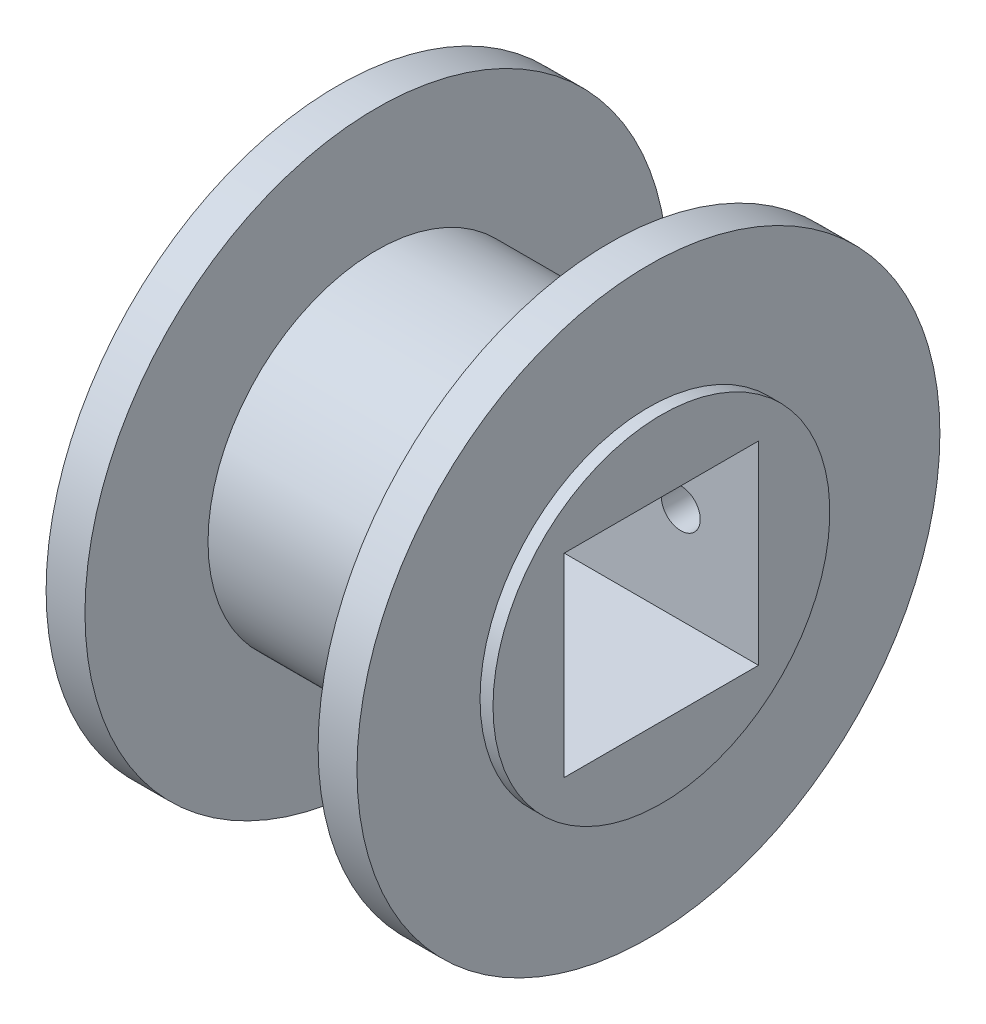
ISO-10303-21;
HEADER;
FILE_DESCRIPTION(('STEP AP214'),'2;1');
FILE_NAME('part.step','',(''),(''),'','','');
FILE_SCHEMA(('AUTOMOTIVE_DESIGN { 1 0 10303 214 1 1 1 1 }'));
ENDSEC;
DATA;
#1=APPLICATION_CONTEXT('core data for automotive mechanical design processes');
#2=APPLICATION_PROTOCOL_DEFINITION('international standard','automotive_design',2000,#1);
#3=PRODUCT_CONTEXT('',#1,'mechanical');
#4=PRODUCT('Part','Part','',(#3));
#5=PRODUCT_RELATED_PRODUCT_CATEGORY('part','',(#4));
#6=PRODUCT_DEFINITION_FORMATION('','',#4);
#7=PRODUCT_DEFINITION_CONTEXT('part definition',#1,'design');
#8=PRODUCT_DEFINITION('design','',#6,#7);
#9=PRODUCT_DEFINITION_SHAPE('','',#8);
#10=(LENGTH_UNIT() NAMED_UNIT(*) SI_UNIT(.MILLI.,.METRE.));
#11=(NAMED_UNIT(*) PLANE_ANGLE_UNIT() SI_UNIT($,.RADIAN.));
#12=(NAMED_UNIT(*) SI_UNIT($,.STERADIAN.) SOLID_ANGLE_UNIT());
#13=UNCERTAINTY_MEASURE_WITH_UNIT(LENGTH_MEASURE(1.E-05),#10,'distance_accuracy_value','');
#14=(GEOMETRIC_REPRESENTATION_CONTEXT(3) GLOBAL_UNCERTAINTY_ASSIGNED_CONTEXT((#13)) GLOBAL_UNIT_ASSIGNED_CONTEXT((#10,
#11,#12)) REPRESENTATION_CONTEXT('',''));
#15=CARTESIAN_POINT('',(0.,0.,0.));
#16=DIRECTION('',(0.,0.,1.));
#17=DIRECTION('',(1.,0.,0.));
#18=AXIS2_PLACEMENT_3D('',#15,#16,#17);
#19=CARTESIAN_POINT('',(-13.,13.,0.));
#20=DIRECTION('',(1.,0.,0.));
#21=DIRECTION('',(0.,0.,-1.));
#22=AXIS2_PLACEMENT_3D('',#19,#20,#21);
#23=PLANE('',#22);
#24=DIRECTION('',(0.,0.,1.));
#25=VECTOR('',#24,1.);
#26=CARTESIAN_POINT('',(-13.,-7.5,7.5));
#27=LINE('',#26,#25);
#28=CARTESIAN_POINT('',(-13.,-7.5,-7.5));
#29=VERTEX_POINT('',#28);
#30=CARTESIAN_POINT('',(-13.,-7.5,7.5));
#31=VERTEX_POINT('',#30);
#32=EDGE_CURVE('E121',#29,#31,#27,.T.);
#33=ORIENTED_EDGE('',*,*,#32,.F.);
#34=DIRECTION('',(0.,-1.,0.));
#35=VECTOR('',#34,1.);
#36=CARTESIAN_POINT('',(-13.,-7.5,-7.5));
#37=LINE('',#36,#35);
#38=CARTESIAN_POINT('',(-13.,7.5,-7.5));
#39=VERTEX_POINT('',#38);
#40=EDGE_CURVE('E54',#39,#29,#37,.T.);
#41=ORIENTED_EDGE('',*,*,#40,.F.);
#42=DIRECTION('',(0.,0.,-1.));
#43=VECTOR('',#42,1.);
#44=CARTESIAN_POINT('',(-13.,7.5,7.5));
#45=LINE('',#44,#43);
#46=CARTESIAN_POINT('',(-13.,7.5,7.5));
#47=VERTEX_POINT('',#46);
#48=EDGE_CURVE('E101',#47,#39,#45,.T.);
#49=ORIENTED_EDGE('',*,*,#48,.F.);
#50=DIRECTION('',(0.,1.,0.));
#51=VECTOR('',#50,1.);
#52=CARTESIAN_POINT('',(-13.,-7.5,7.5));
#53=LINE('',#52,#51);
#54=EDGE_CURVE('E105',#31,#47,#53,.T.);
#55=ORIENTED_EDGE('',*,*,#54,.F.);
#56=EDGE_LOOP('',(#33,#41,#49,#55));
#57=FACE_BOUND('',#56,.T.);
#58=CARTESIAN_POINT('',(-13.,0.,0.));
#59=DIRECTION('',(-1.,0.,0.));
#60=DIRECTION('',(0.,0.,1.));
#61=AXIS2_PLACEMENT_3D('',#58,#59,#60);
#62=CIRCLE('',#61,13.);
#63=CARTESIAN_POINT('',(-13.,0.,13.));
#64=VERTEX_POINT('',#63);
#65=EDGE_CURVE('E130',#64,#64,#62,.T.);
#66=ORIENTED_EDGE('',*,*,#65,.T.);
#67=EDGE_LOOP('',(#66));
#68=FACE_BOUND('',#67,.T.);
#69=ADVANCED_FACE('F38',(#57,#68),#23,.F.);
#70=CARTESIAN_POINT('',(13.,0.,0.));
#71=DIRECTION('',(-1.,0.,0.));
#72=DIRECTION('',(0.,0.,1.));
#73=AXIS2_PLACEMENT_3D('',#70,#71,#72);
#74=PLANE('',#73);
#75=DIRECTION('',(0.,0.,-1.));
#76=VECTOR('',#75,1.);
#77=CARTESIAN_POINT('',(13.,7.5,7.5));
#78=LINE('',#77,#76);
#79=CARTESIAN_POINT('',(13.,7.5,7.5));
#80=VERTEX_POINT('',#79);
#81=CARTESIAN_POINT('',(13.,7.5,-7.5));
#82=VERTEX_POINT('',#81);
#83=EDGE_CURVE('E89',#80,#82,#78,.T.);
#84=ORIENTED_EDGE('',*,*,#83,.T.);
#85=DIRECTION('',(0.,-1.,0.));
#86=VECTOR('',#85,1.);
#87=CARTESIAN_POINT('',(13.,-7.5,-7.5));
#88=LINE('',#87,#86);
#89=CARTESIAN_POINT('',(13.,-7.5,-7.5));
#90=VERTEX_POINT('',#89);
#91=EDGE_CURVE('E82',#82,#90,#88,.T.);
#92=ORIENTED_EDGE('',*,*,#91,.T.);
#93=DIRECTION('',(0.,0.,1.));
#94=VECTOR('',#93,1.);
#95=CARTESIAN_POINT('',(13.,-7.5,7.5));
#96=LINE('',#95,#94);
#97=CARTESIAN_POINT('',(13.,-7.5,7.5));
#98=VERTEX_POINT('',#97);
#99=EDGE_CURVE('E92',#90,#98,#96,.T.);
#100=ORIENTED_EDGE('',*,*,#99,.T.);
#101=DIRECTION('',(0.,1.,0.));
#102=VECTOR('',#101,1.);
#103=CARTESIAN_POINT('',(13.,-7.5,7.5));
#104=LINE('',#103,#102);
#105=EDGE_CURVE('E62',#98,#80,#104,.T.);
#106=ORIENTED_EDGE('',*,*,#105,.T.);
#107=EDGE_LOOP('',(#84,#92,#100,#106));
#108=FACE_BOUND('',#107,.T.);
#109=CARTESIAN_POINT('',(13.,0.,0.));
#110=DIRECTION('',(-1.,0.,0.));
#111=DIRECTION('',(0.,0.,1.));
#112=AXIS2_PLACEMENT_3D('',#109,#110,#111);
#113=CIRCLE('',#112,13.);
#114=CARTESIAN_POINT('',(13.,0.,13.));
#115=VERTEX_POINT('',#114);
#116=EDGE_CURVE('E11',#115,#115,#113,.T.);
#117=ORIENTED_EDGE('',*,*,#116,.F.);
#118=EDGE_LOOP('',(#117));
#119=FACE_BOUND('',#118,.T.);
#120=ADVANCED_FACE('F97',(#108,#119),#74,.F.);
#121=CARTESIAN_POINT('',(-15.7092417804402,0.,0.));
#122=DIRECTION('',(-1.,0.,0.));
#123=DIRECTION('',(0.,0.,1.));
#124=AXIS2_PLACEMENT_3D('',#121,#122,#123);
#125=CYLINDRICAL_SURFACE('',#124,13.);
#126=CARTESIAN_POINT('',(12.,0.,0.));
#127=DIRECTION('',(-1.,0.,0.));
#128=DIRECTION('',(0.,0.,1.));
#129=AXIS2_PLACEMENT_3D('',#126,#127,#128);
#130=CIRCLE('',#129,13.);
#131=CARTESIAN_POINT('',(12.,0.,13.));
#132=VERTEX_POINT('',#131);
#133=EDGE_CURVE('E47',#132,#132,#130,.T.);
#134=ORIENTED_EDGE('',*,*,#133,.F.);
#135=EDGE_LOOP('',(#134));
#136=FACE_BOUND('',#135,.T.);
#137=ORIENTED_EDGE('',*,*,#116,.T.);
#138=EDGE_LOOP('',(#137));
#139=FACE_BOUND('',#138,.T.);
#140=ADVANCED_FACE('F173',(#136,#139),#125,.T.);
#141=CARTESIAN_POINT('',(12.,13.,0.));
#142=DIRECTION('',(-1.,0.,0.));
#143=DIRECTION('',(0.,0.,1.));
#144=AXIS2_PLACEMENT_3D('',#141,#142,#143);
#145=PLANE('',#144);
#146=CARTESIAN_POINT('',(12.,0.,0.));
#147=DIRECTION('',(-1.,0.,0.));
#148=DIRECTION('',(0.,0.,1.));
#149=AXIS2_PLACEMENT_3D('',#146,#147,#148);
#150=CIRCLE('',#149,22.5);
#151=CARTESIAN_POINT('',(12.,0.,22.5));
#152=VERTEX_POINT('',#151);
#153=EDGE_CURVE('E163',#152,#152,#150,.T.);
#154=ORIENTED_EDGE('',*,*,#153,.F.);
#155=EDGE_LOOP('',(#154));
#156=FACE_BOUND('',#155,.T.);
#157=ORIENTED_EDGE('',*,*,#133,.T.);
#158=EDGE_LOOP('',(#157));
#159=FACE_BOUND('',#158,.T.);
#160=ADVANCED_FACE('F171',(#156,#159),#145,.F.);
#161=CARTESIAN_POINT('',(-15.7092417804402,0.,0.));
#162=DIRECTION('',(-1.,0.,0.));
#163=DIRECTION('',(0.,0.,1.));
#164=AXIS2_PLACEMENT_3D('',#161,#162,#163);
#165=CYLINDRICAL_SURFACE('',#164,22.5);
#166=CARTESIAN_POINT('',(8.99999999999999,0.,0.));
#167=DIRECTION('',(-1.,0.,0.));
#168=DIRECTION('',(0.,0.,1.));
#169=AXIS2_PLACEMENT_3D('',#166,#167,#168);
#170=CIRCLE('',#169,22.5);
#171=CARTESIAN_POINT('',(8.99999999999999,0.,22.5));
#172=VERTEX_POINT('',#171);
#173=EDGE_CURVE('E159',#172,#172,#170,.T.);
#174=ORIENTED_EDGE('',*,*,#173,.F.);
#175=EDGE_LOOP('',(#174));
#176=FACE_BOUND('',#175,.T.);
#177=ORIENTED_EDGE('',*,*,#153,.T.);
#178=EDGE_LOOP('',(#177));
#179=FACE_BOUND('',#178,.T.);
#180=ADVANCED_FACE('F186',(#176,#179),#165,.T.);
#181=CARTESIAN_POINT('',(9.,22.5,0.));
#182=DIRECTION('',(1.,0.,0.));
#183=DIRECTION('',(0.,0.,-1.));
#184=AXIS2_PLACEMENT_3D('',#181,#182,#183);
#185=PLANE('',#184);
#186=CARTESIAN_POINT('',(9.,0.,0.));
#187=DIRECTION('',(-1.,0.,0.));
#188=DIRECTION('',(0.,0.,1.));
#189=AXIS2_PLACEMENT_3D('',#186,#187,#188);
#190=CIRCLE('',#189,13.);
#191=CARTESIAN_POINT('',(9.,0.,13.));
#192=VERTEX_POINT('',#191);
#193=EDGE_CURVE('E155',#192,#192,#190,.T.);
#194=ORIENTED_EDGE('',*,*,#193,.F.);
#195=EDGE_LOOP('',(#194));
#196=FACE_BOUND('',#195,.T.);
#197=ORIENTED_EDGE('',*,*,#173,.T.);
#198=EDGE_LOOP('',(#197));
#199=FACE_BOUND('',#198,.T.);
#200=ADVANCED_FACE('F190',(#196,#199),#185,.F.);
#201=CARTESIAN_POINT('',(-15.7092417804402,0.,0.));
#202=DIRECTION('',(-1.,0.,0.));
#203=DIRECTION('',(0.,0.,1.));
#204=AXIS2_PLACEMENT_3D('',#201,#202,#203);
#205=CYLINDRICAL_SURFACE('',#204,13.);
#206=CARTESIAN_POINT('',(8.5,0.,-13.));
#207=CARTESIAN_POINT('',(8.4999964031671,0.0839563147427419,-12.9999989044515));
#208=CARTESIAN_POINT('',(8.4929275849652,0.167966345196187,-12.999178081572));
#209=CARTESIAN_POINT('',(8.46483826496663,0.333652235419371,-12.995982599614));
#210=CARTESIAN_POINT('',(8.44380286531638,0.415325505475652,-12.9936062813601));
#211=CARTESIAN_POINT('',(8.38840533385725,0.573914972249219,-12.9875677351869));
#212=CARTESIAN_POINT('',(8.35405179569065,0.650834199520697,-12.9839063366207));
#213=CARTESIAN_POINT('',(8.27301111812132,0.797799793787138,-12.9757057473599));
#214=CARTESIAN_POINT('',(8.22632623210123,0.867847413269115,-12.9711667170809));
#215=CARTESIAN_POINT('',(8.12171196440118,0.999427807179225,-12.9616943551208));
#216=CARTESIAN_POINT('',(8.06373605262275,1.06092347729182,-12.9567594432832));
#217=CARTESIAN_POINT('',(7.93828516324756,1.17333502414497,-12.9470643855765));
#218=CARTESIAN_POINT('',(7.87080972079665,1.2242503828419,-12.9423042482743));
#219=CARTESIAN_POINT('',(7.72803733610484,1.3141916873334,-12.9334819604022));
#220=CARTESIAN_POINT('',(7.65271863992229,1.3531833171573,-12.9294218388056));
#221=CARTESIAN_POINT('',(7.49654783804119,1.41795120910938,-12.9224797052987));
#222=CARTESIAN_POINT('',(7.41569591201296,1.44372790011126,-12.9195976551562));
#223=CARTESIAN_POINT('',(7.25113647537629,1.48122247723766,-12.9153528047108));
#224=CARTESIAN_POINT('',(7.1674433262594,1.49300261981048,-12.9139832786549));
#225=CARTESIAN_POINT('',(6.99925756045587,1.50236226854616,-12.9128978570991));
#226=CARTESIAN_POINT('',(6.91476497143116,1.49994226427626,-12.9131819045903));
#227=CARTESIAN_POINT('',(6.74781068672891,1.48102150197295,-12.9153653842397));
#228=CARTESIAN_POINT('',(6.66534113040741,1.46458907258954,-12.9172569773873));
#229=CARTESIAN_POINT('',(6.50433810598175,1.41821640637187,-12.9224301836669));
#230=CARTESIAN_POINT('',(6.42580470681433,1.38827593305336,-12.9257118211342));
#231=CARTESIAN_POINT('',(6.27468953076391,1.31566282618376,-12.9333043079058));
#232=CARTESIAN_POINT('',(6.20212227049773,1.27296024500285,-12.9376175732259));
#233=CARTESIAN_POINT('',(6.06515827049276,1.17605655290097,-12.9467853893456));
#234=CARTESIAN_POINT('',(6.00076184949449,1.12185499363063,-12.9516399612475));
#235=CARTESIAN_POINT('',(5.88157071619169,1.0031120359915,-12.9613782949516));
#236=CARTESIAN_POINT('',(5.82683470870206,0.938511694342138,-12.9662620604919));
#237=CARTESIAN_POINT('',(5.72897438783242,0.801008592236029,-12.9754816969276));
#238=CARTESIAN_POINT('',(5.68585009493269,0.728105817136098,-12.9798175668567));
#239=CARTESIAN_POINT('',(5.61243828715519,0.57602390567987,-12.9874550212078));
#240=CARTESIAN_POINT('',(5.58215416157141,0.496843118716624,-12.9907563324875));
#241=CARTESIAN_POINT('',(5.53532747265761,0.334473831095742,-12.9959501177405));
#242=CARTESIAN_POINT('',(5.51878436163704,0.251285490311374,-12.9978426478647));
#243=CARTESIAN_POINT('',(5.49998472362038,0.083770420005017,-12.999998373659));
#244=CARTESIAN_POINT('',(5.49764727106811,-0.000547113543200863,-13.0002707984128));
#245=CARTESIAN_POINT('',(5.50711215461105,-0.168372695685006,-12.9991804669134));
#246=CARTESIAN_POINT('',(5.51891423501223,-0.251880758889223,-12.9978177402298));
#247=CARTESIAN_POINT('',(5.55625597280801,-0.415480266956156,-12.993616027243));
#248=CARTESIAN_POINT('',(5.58175732870877,-0.49558056887289,-12.9907811576039));
#249=CARTESIAN_POINT('',(5.64573409622904,-0.650367161714353,-12.9839527929212));
#250=CARTESIAN_POINT('',(5.68420988816444,-0.725053293857112,-12.9799592639147));
#251=CARTESIAN_POINT('',(5.77324114512289,-0.867254744569761,-12.9712363785455));
#252=CARTESIAN_POINT('',(5.82384929591282,-0.934736878832462,-12.9665038451426));
#253=CARTESIAN_POINT('',(5.93563374481516,-1.06027784673837,-12.9568430886348));
#254=CARTESIAN_POINT('',(5.99681039844914,-1.11833636324618,-12.9519148589511));
#255=CARTESIAN_POINT('',(6.12835038533594,-1.22366664140002,-12.9423899602444));
#256=CARTESIAN_POINT('',(6.1987566435089,-1.27088497439797,-12.9377950067668));
#257=CARTESIAN_POINT('',(6.34654757584497,-1.35282617315314,-12.9294843210235));
#258=CARTESIAN_POINT('',(6.42393212787651,-1.38754925754462,-12.9257685733744));
#259=CARTESIAN_POINT('',(6.58330615373548,-1.44342658284102,-12.9196483466479));
#260=CARTESIAN_POINT('',(6.66528470793036,-1.46461162925532,-12.91724089246));
#261=CARTESIAN_POINT('',(6.83166493951436,-1.49291104062265,-12.9140010380224));
#262=CARTESIAN_POINT('',(6.91606652196453,-1.50002595610949,-12.9131685761468));
#263=CARTESIAN_POINT('',(7.08436565375942,-1.49997405326828,-12.9131745631781));
#264=CARTESIAN_POINT('',(7.168263241811,-1.49289116482699,-12.9140031925958));
#265=CARTESIAN_POINT('',(7.33366750199322,-1.46482172327171,-12.9172169582806));
#266=CARTESIAN_POINT('',(7.41517417276498,-1.44383516225563,-12.9196020954323));
#267=CARTESIAN_POINT('',(7.57347609168934,-1.38857911797312,-12.9256572251488));
#268=CARTESIAN_POINT('',(7.65027254258118,-1.35431304208042,-12.9293268880955));
#269=CARTESIAN_POINT('',(7.79703840038788,-1.27347900341466,-12.9375381901497));
#270=CARTESIAN_POINT('',(7.86700777212214,-1.22691097725304,-12.9420798337501));
#271=CARTESIAN_POINT('',(7.99856295332931,-1.12248173071088,-12.9515555600008));
#272=CARTESIAN_POINT('',(8.06009892117499,-1.06455790771248,-12.9564917239034));
#273=CARTESIAN_POINT('',(8.17261111489077,-0.939190054186288,-12.9661816355574));
#274=CARTESIAN_POINT('',(8.22358483240877,-0.871743768617547,-12.9709353397599));
#275=CARTESIAN_POINT('',(8.31366356407028,-0.72899689319709,-12.9797415177439));
#276=CARTESIAN_POINT('',(8.35272930568544,-0.65367139151142,-12.9837916526637));
#277=CARTESIAN_POINT('',(8.41760310503946,-0.497527270565882,-12.9907101076695));
#278=CARTESIAN_POINT('',(8.44342579213558,-0.416714824913398,-12.993579731148));
#279=CARTESIAN_POINT('',(8.47479285483811,-0.279556305332049,-12.9971099824635));
#280=CARTESIAN_POINT('',(8.48423222713368,-0.224080319679961,-12.9981885527758));
#281=CARTESIAN_POINT('',(8.49683698528068,-0.112410914672187,-12.9996339262189));
#282=CARTESIAN_POINT('',(8.50000240845436,-0.0562174995863219,-13.0000007335839));
#283=CARTESIAN_POINT('',(8.5,0.,-13.));
#284=B_SPLINE_CURVE_WITH_KNOTS('',3,(#206,#207,#208,#209,#210,#211,#212,#213,#214,#215,#216,
#217,#218,#219,#220,#221,#222,#223,#224,#225,#226,#227,#228,#229,#230,#231,#232,#233,#234,#235,
#236,#237,#238,#239,#240,#241,#242,#243,#244,#245,#246,#247,#248,#249,#250,#251,#252,#253,#254,
#255,#256,#257,#258,#259,#260,#261,#262,#263,#264,#265,#266,#267,#268,#269,#270,#271,#272,#273,
#274,#275,#276,#277,#278,#279,#280,#281,#282,#283),.UNSPECIFIED.,.T.,.F.,(4,2,2,2,2,2,2,2,2,2,2,
2,2,2,2,2,2,2,2,2,2,2,2,2,2,2,2,2,2,2,2,2,2,2,2,2,2,2,4),(0.,0.251663624421978,
0.503596125244171,0.755366334321086,1.00709056767771,1.25987498270023,1.51267177188699,
1.76618939688668,2.01969879377989,2.27207631201581,2.52444512928255,2.7755903144011,
3.02673989646913,3.27848351780672,3.53023695652505,3.7834711988091,4.0367058877347,
4.29000737900444,4.54329877367693,4.79514587715501,5.04698842639316,5.29813049175019,
5.54927991940193,5.80154039645153,6.05380936112788,6.30729621090898,6.56077862511547,
6.81368217226277,7.06657582364479,7.31797891068328,7.56938214060553,7.82072090595901,
8.07206096641733,8.3248276967652,8.57765438622355,8.83130609524226,9.08467699305617,
9.25319301127889,9.42170802703663),.UNSPECIFIED.);
#285=CARTESIAN_POINT('',(8.5,0.,-13.));
#286=VERTEX_POINT('',#285);
#287=EDGE_CURVE('E108',#286,#286,#284,.T.);
#288=ORIENTED_EDGE('',*,*,#287,.T.);
#289=EDGE_LOOP('',(#288));
#290=FACE_BOUND('',#289,.T.);
#291=CARTESIAN_POINT('',(-9.,0.,0.));
#292=DIRECTION('',(-1.,0.,0.));
#293=DIRECTION('',(0.,0.,1.));
#294=AXIS2_PLACEMENT_3D('',#291,#292,#293);
#295=CIRCLE('',#294,13.);
#296=CARTESIAN_POINT('',(-9.,0.,13.));
#297=VERTEX_POINT('',#296);
#298=EDGE_CURVE('E151',#297,#297,#295,.T.);
#299=ORIENTED_EDGE('',*,*,#298,.F.);
#300=EDGE_LOOP('',(#299));
#301=FACE_BOUND('',#300,.T.);
#302=ORIENTED_EDGE('',*,*,#193,.T.);
#303=EDGE_LOOP('',(#302));
#304=FACE_BOUND('',#303,.T.);
#305=ADVANCED_FACE('F193',(#290,#301,#304),#205,.T.);
#306=CARTESIAN_POINT('',(-9.,13.,0.));
#307=DIRECTION('',(-1.,0.,0.));
#308=DIRECTION('',(0.,0.,1.));
#309=AXIS2_PLACEMENT_3D('',#306,#307,#308);
#310=PLANE('',#309);
#311=CARTESIAN_POINT('',(-9.,0.,0.));
#312=DIRECTION('',(-1.,0.,0.));
#313=DIRECTION('',(0.,0.,1.));
#314=AXIS2_PLACEMENT_3D('',#311,#312,#313);
#315=CIRCLE('',#314,22.5);
#316=CARTESIAN_POINT('',(-9.,0.,22.5));
#317=VERTEX_POINT('',#316);
#318=EDGE_CURVE('E147',#317,#317,#315,.T.);
#319=ORIENTED_EDGE('',*,*,#318,.F.);
#320=EDGE_LOOP('',(#319));
#321=FACE_BOUND('',#320,.T.);
#322=ORIENTED_EDGE('',*,*,#298,.T.);
#323=EDGE_LOOP('',(#322));
#324=FACE_BOUND('',#323,.T.);
#325=ADVANCED_FACE('F198',(#321,#324),#310,.F.);
#326=CARTESIAN_POINT('',(-15.7092417804402,0.,0.));
#327=DIRECTION('',(-1.,0.,0.));
#328=DIRECTION('',(0.,0.,1.));
#329=AXIS2_PLACEMENT_3D('',#326,#327,#328);
#330=CYLINDRICAL_SURFACE('',#329,22.5);
#331=CARTESIAN_POINT('',(-12.,0.,0.));
#332=DIRECTION('',(-1.,0.,0.));
#333=DIRECTION('',(0.,0.,1.));
#334=AXIS2_PLACEMENT_3D('',#331,#332,#333);
#335=CIRCLE('',#334,22.5);
#336=CARTESIAN_POINT('',(-12.,0.,22.5));
#337=VERTEX_POINT('',#336);
#338=EDGE_CURVE('E143',#337,#337,#335,.T.);
#339=ORIENTED_EDGE('',*,*,#338,.F.);
#340=EDGE_LOOP('',(#339));
#341=FACE_BOUND('',#340,.T.);
#342=ORIENTED_EDGE('',*,*,#318,.T.);
#343=EDGE_LOOP('',(#342));
#344=FACE_BOUND('',#343,.T.);
#345=ADVANCED_FACE('F202',(#341,#344),#330,.T.);
#346=CARTESIAN_POINT('',(-12.,22.5,0.));
#347=DIRECTION('',(1.,0.,0.));
#348=DIRECTION('',(0.,0.,-1.));
#349=AXIS2_PLACEMENT_3D('',#346,#347,#348);
#350=PLANE('',#349);
#351=CARTESIAN_POINT('',(-12.,0.,0.));
#352=DIRECTION('',(-1.,0.,0.));
#353=DIRECTION('',(0.,0.,1.));
#354=AXIS2_PLACEMENT_3D('',#351,#352,#353);
#355=CIRCLE('',#354,13.);
#356=CARTESIAN_POINT('',(-12.,0.,13.));
#357=VERTEX_POINT('',#356);
#358=EDGE_CURVE('E139',#357,#357,#355,.T.);
#359=ORIENTED_EDGE('',*,*,#358,.F.);
#360=EDGE_LOOP('',(#359));
#361=FACE_BOUND('',#360,.T.);
#362=ORIENTED_EDGE('',*,*,#338,.T.);
#363=EDGE_LOOP('',(#362));
#364=FACE_BOUND('',#363,.T.);
#365=ADVANCED_FACE('F206',(#361,#364),#350,.F.);
#366=CARTESIAN_POINT('',(-15.7092417804402,0.,0.));
#367=DIRECTION('',(-1.,0.,0.));
#368=DIRECTION('',(0.,0.,1.));
#369=AXIS2_PLACEMENT_3D('',#366,#367,#368);
#370=CYLINDRICAL_SURFACE('',#369,13.);
#371=ORIENTED_EDGE('',*,*,#65,.F.);
#372=EDGE_LOOP('',(#371));
#373=FACE_BOUND('',#372,.T.);
#374=ORIENTED_EDGE('',*,*,#358,.T.);
#375=EDGE_LOOP('',(#374));
#376=FACE_BOUND('',#375,.T.);
#377=ADVANCED_FACE('F210',(#373,#376),#370,.T.);
#378=CARTESIAN_POINT('',(13.,-7.5,-7.5));
#379=DIRECTION('',(0.,0.,-1.));
#380=DIRECTION('',(-1.,0.,0.));
#381=AXIS2_PLACEMENT_3D('',#378,#379,#380);
#382=PLANE('',#381);
#383=CARTESIAN_POINT('',(7.,0.,-7.5));
#384=DIRECTION('',(0.,0.,-1.));
#385=DIRECTION('',(-1.,0.,0.));
#386=AXIS2_PLACEMENT_3D('',#383,#384,#385);
#387=CIRCLE('',#386,1.5);
#388=CARTESIAN_POINT('',(5.5,0.,-7.5));
#389=VERTEX_POINT('',#388);
#390=EDGE_CURVE('E41',#389,#389,#387,.T.);
#391=ORIENTED_EDGE('',*,*,#390,.T.);
#392=EDGE_LOOP('',(#391));
#393=FACE_BOUND('',#392,.T.);
#394=ORIENTED_EDGE('',*,*,#40,.T.);
#395=DIRECTION('',(-1.,0.,0.));
#396=VECTOR('',#395,1.);
#397=CARTESIAN_POINT('',(13.,-7.5,-7.5));
#398=LINE('',#397,#396);
#399=EDGE_CURVE('E78',#90,#29,#398,.T.);
#400=ORIENTED_EDGE('',*,*,#399,.F.);
#401=ORIENTED_EDGE('',*,*,#91,.F.);
#402=DIRECTION('',(-1.,0.,0.));
#403=VECTOR('',#402,1.);
#404=CARTESIAN_POINT('',(13.,7.5,-7.5));
#405=LINE('',#404,#403);
#406=EDGE_CURVE('E127',#82,#39,#405,.T.);
#407=ORIENTED_EDGE('',*,*,#406,.T.);
#408=EDGE_LOOP('',(#394,#400,#401,#407));
#409=FACE_BOUND('',#408,.T.);
#410=ADVANCED_FACE('F80',(#393,#409),#382,.F.);
#411=CARTESIAN_POINT('',(13.,7.5,7.5));
#412=DIRECTION('',(0.,1.,0.));
#413=DIRECTION('',(0.,0.,1.));
#414=AXIS2_PLACEMENT_3D('',#411,#412,#413);
#415=PLANE('',#414);
#416=ORIENTED_EDGE('',*,*,#48,.T.);
#417=ORIENTED_EDGE('',*,*,#406,.F.);
#418=ORIENTED_EDGE('',*,*,#83,.F.);
#419=DIRECTION('',(-1.,0.,0.));
#420=VECTOR('',#419,1.);
#421=CARTESIAN_POINT('',(13.,7.5,7.5));
#422=LINE('',#421,#420);
#423=EDGE_CURVE('E131',#80,#47,#422,.T.);
#424=ORIENTED_EDGE('',*,*,#423,.T.);
#425=EDGE_LOOP('',(#416,#417,#418,#424));
#426=FACE_BOUND('',#425,.T.);
#427=ADVANCED_FACE('F217',(#426),#415,.F.);
#428=CARTESIAN_POINT('',(13.,-7.5,7.5));
#429=DIRECTION('',(0.,0.,1.));
#430=DIRECTION('',(1.,0.,0.));
#431=AXIS2_PLACEMENT_3D('',#428,#429,#430);
#432=PLANE('',#431);
#433=ORIENTED_EDGE('',*,*,#54,.T.);
#434=ORIENTED_EDGE('',*,*,#423,.F.);
#435=ORIENTED_EDGE('',*,*,#105,.F.);
#436=DIRECTION('',(-1.,0.,0.));
#437=VECTOR('',#436,1.);
#438=CARTESIAN_POINT('',(13.,-7.5,7.5));
#439=LINE('',#438,#437);
#440=EDGE_CURVE('E88',#98,#31,#439,.T.);
#441=ORIENTED_EDGE('',*,*,#440,.T.);
#442=EDGE_LOOP('',(#433,#434,#435,#441));
#443=FACE_BOUND('',#442,.T.);
#444=ADVANCED_FACE('F222',(#443),#432,.F.);
#445=CARTESIAN_POINT('',(13.,-7.5,7.5));
#446=DIRECTION('',(0.,-1.,0.));
#447=DIRECTION('',(0.,0.,-1.));
#448=AXIS2_PLACEMENT_3D('',#445,#446,#447);
#449=PLANE('',#448);
#450=ORIENTED_EDGE('',*,*,#32,.T.);
#451=ORIENTED_EDGE('',*,*,#440,.F.);
#452=ORIENTED_EDGE('',*,*,#99,.F.);
#453=ORIENTED_EDGE('',*,*,#399,.T.);
#454=EDGE_LOOP('',(#450,#451,#452,#453));
#455=FACE_BOUND('',#454,.T.);
#456=ADVANCED_FACE('F93',(#455),#449,.F.);
#457=CARTESIAN_POINT('',(7.,0.,-22.5));
#458=DIRECTION('',(0.,0.,1.));
#459=DIRECTION('',(1.,0.,0.));
#460=AXIS2_PLACEMENT_3D('',#457,#458,#459);
#461=CYLINDRICAL_SURFACE('',#460,1.5);
#462=ORIENTED_EDGE('',*,*,#390,.F.);
#463=EDGE_LOOP('',(#462));
#464=FACE_BOUND('',#463,.T.);
#465=ORIENTED_EDGE('',*,*,#287,.F.);
#466=EDGE_LOOP('',(#465));
#467=FACE_BOUND('',#466,.T.);
#468=ADVANCED_FACE('F221',(#464,#467),#461,.F.);
#469=CLOSED_SHELL('',(#69,#120,#140,#160,#180,#200,#305,#325,#345,#365,#377,#410,#427,#444,#456,#468));
#470=MANIFOLD_SOLID_BREP('B2',#469);
#471=ADVANCED_BREP_SHAPE_REPRESENTATION('',(#18,#470),#14);
#472=SHAPE_DEFINITION_REPRESENTATION(#9,#471);
ENDSEC;
END-ISO-10303-21;
